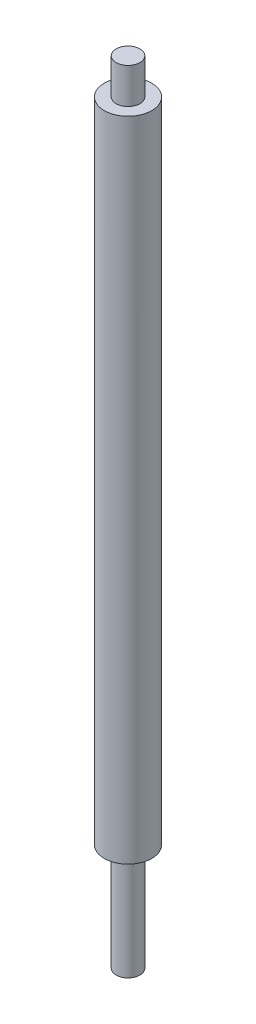
ISO-10303-21;
HEADER;
FILE_DESCRIPTION(('STEP AP214'),'2;1');
FILE_NAME('part.step','',(''),(''),'','','');
FILE_SCHEMA(('AUTOMOTIVE_DESIGN { 1 0 10303 214 1 1 1 1 }'));
ENDSEC;
DATA;
#1=APPLICATION_CONTEXT('core data for automotive mechanical design processes');
#2=APPLICATION_PROTOCOL_DEFINITION('international standard','automotive_design',2000,#1);
#3=PRODUCT_CONTEXT('',#1,'mechanical');
#4=PRODUCT('Part','Part','',(#3));
#5=PRODUCT_RELATED_PRODUCT_CATEGORY('part','',(#4));
#6=PRODUCT_DEFINITION_FORMATION('','',#4);
#7=PRODUCT_DEFINITION_CONTEXT('part definition',#1,'design');
#8=PRODUCT_DEFINITION('design','',#6,#7);
#9=PRODUCT_DEFINITION_SHAPE('','',#8);
#10=(LENGTH_UNIT() NAMED_UNIT(*) SI_UNIT(.MILLI.,.METRE.));
#11=(NAMED_UNIT(*) PLANE_ANGLE_UNIT() SI_UNIT($,.RADIAN.));
#12=(NAMED_UNIT(*) SI_UNIT($,.STERADIAN.) SOLID_ANGLE_UNIT());
#13=UNCERTAINTY_MEASURE_WITH_UNIT(LENGTH_MEASURE(1.E-05),#10,'distance_accuracy_value','');
#14=(GEOMETRIC_REPRESENTATION_CONTEXT(3) GLOBAL_UNCERTAINTY_ASSIGNED_CONTEXT((#13)) GLOBAL_UNIT_ASSIGNED_CONTEXT((#10,
#11,#12)) REPRESENTATION_CONTEXT('',''));
#15=CARTESIAN_POINT('',(0.,0.,0.));
#16=DIRECTION('',(0.,0.,1.));
#17=DIRECTION('',(1.,0.,0.));
#18=AXIS2_PLACEMENT_3D('',#15,#16,#17);
#19=CARTESIAN_POINT('',(0.,211.1375,0.));
#20=DIRECTION('',(0.,-1.,0.));
#21=DIRECTION('',(0.,0.,-1.));
#22=AXIS2_PLACEMENT_3D('',#19,#20,#21);
#23=CYLINDRICAL_SURFACE('',#22,6.35);
#24=CARTESIAN_POINT('',(0.,201.6125,0.));
#25=DIRECTION('',(0.,1.,0.));
#26=DIRECTION('',(0.,0.,1.));
#27=AXIS2_PLACEMENT_3D('',#24,#25,#26);
#28=CIRCLE('',#27,6.35);
#29=CARTESIAN_POINT('',(0.,201.6125,6.35));
#30=VERTEX_POINT('',#29);
#31=EDGE_CURVE('E10',#30,#30,#28,.T.);
#32=ORIENTED_EDGE('',*,*,#31,.F.);
#33=EDGE_LOOP('',(#32));
#34=FACE_BOUND('',#33,.T.);
#35=CARTESIAN_POINT('',(0.,28.575,0.));
#36=DIRECTION('',(0.,-1.,0.));
#37=DIRECTION('',(0.,0.,-1.));
#38=AXIS2_PLACEMENT_3D('',#35,#36,#37);
#39=CIRCLE('',#38,6.35);
#40=CARTESIAN_POINT('',(0.,28.575,-6.35));
#41=VERTEX_POINT('',#40);
#42=EDGE_CURVE('E46',#41,#41,#39,.T.);
#43=ORIENTED_EDGE('',*,*,#42,.F.);
#44=EDGE_LOOP('',(#43));
#45=FACE_BOUND('',#44,.T.);
#46=ADVANCED_FACE('F31',(#34,#45),#23,.T.);
#47=CARTESIAN_POINT('',(0.,201.6125,0.));
#48=DIRECTION('',(0.,1.,0.));
#49=DIRECTION('',(0.,0.,1.));
#50=AXIS2_PLACEMENT_3D('',#47,#48,#49);
#51=PLANE('',#50);
#52=CARTESIAN_POINT('',(0.,201.6125,0.));
#53=DIRECTION('',(0.,1.,0.));
#54=DIRECTION('',(0.,0.,1.));
#55=AXIS2_PLACEMENT_3D('',#52,#53,#54);
#56=CIRCLE('',#55,3.175);
#57=CARTESIAN_POINT('',(0.,201.6125,3.175));
#58=VERTEX_POINT('',#57);
#59=EDGE_CURVE('E37',#58,#58,#56,.T.);
#60=ORIENTED_EDGE('',*,*,#59,.F.);
#61=EDGE_LOOP('',(#60));
#62=FACE_BOUND('',#61,.T.);
#63=ORIENTED_EDGE('',*,*,#31,.T.);
#64=EDGE_LOOP('',(#63));
#65=FACE_BOUND('',#64,.T.);
#66=ADVANCED_FACE('F68',(#62,#65),#51,.T.);
#67=CARTESIAN_POINT('',(0.,201.6125,0.));
#68=DIRECTION('',(0.,1.,0.));
#69=DIRECTION('',(0.,0.,1.));
#70=AXIS2_PLACEMENT_3D('',#67,#68,#69);
#71=CYLINDRICAL_SURFACE('',#70,3.175);
#72=CARTESIAN_POINT('',(0.,211.1375,0.));
#73=DIRECTION('',(0.,1.,0.));
#74=DIRECTION('',(0.,0.,1.));
#75=AXIS2_PLACEMENT_3D('',#72,#73,#74);
#76=CIRCLE('',#75,3.175);
#77=CARTESIAN_POINT('',(0.,211.1375,3.175));
#78=VERTEX_POINT('',#77);
#79=EDGE_CURVE('E41',#78,#78,#76,.T.);
#80=CARTESIAN_POINT('',(0.,201.6125,3.175));
#81=CARTESIAN_POINT('',(0.,201.71171875,3.175));
#82=CARTESIAN_POINT('',(0.,201.8109375,3.175));
#83=CARTESIAN_POINT('',(0.,202.009375,3.175));
#84=CARTESIAN_POINT('',(0.,202.10859375,3.175));
#85=CARTESIAN_POINT('',(0.,202.30703125,3.175));
#86=CARTESIAN_POINT('',(0.,202.40625,3.175));
#87=CARTESIAN_POINT('',(0.,202.6046875,3.175));
#88=CARTESIAN_POINT('',(0.,202.70390625,3.175));
#89=CARTESIAN_POINT('',(0.,202.90234375,3.175));
#90=CARTESIAN_POINT('',(0.,203.0015625,3.175));
#91=CARTESIAN_POINT('',(0.,203.2,3.175));
#92=CARTESIAN_POINT('',(0.,203.29921875,3.175));
#93=CARTESIAN_POINT('',(0.,203.49765625,3.175));
#94=CARTESIAN_POINT('',(0.,203.596875,3.175));
#95=CARTESIAN_POINT('',(0.,203.7953125,3.175));
#96=CARTESIAN_POINT('',(0.,203.89453125,3.175));
#97=CARTESIAN_POINT('',(0.,204.09296875,3.175));
#98=CARTESIAN_POINT('',(0.,204.1921875,3.175));
#99=CARTESIAN_POINT('',(0.,204.390625,3.175));
#100=CARTESIAN_POINT('',(0.,204.48984375,3.175));
#101=CARTESIAN_POINT('',(0.,204.68828125,3.175));
#102=CARTESIAN_POINT('',(0.,204.7875,3.175));
#103=CARTESIAN_POINT('',(0.,204.9859375,3.175));
#104=CARTESIAN_POINT('',(0.,205.08515625,3.175));
#105=CARTESIAN_POINT('',(0.,205.28359375,3.175));
#106=CARTESIAN_POINT('',(0.,205.3828125,3.175));
#107=CARTESIAN_POINT('',(0.,205.58125,3.175));
#108=CARTESIAN_POINT('',(0.,205.68046875,3.175));
#109=CARTESIAN_POINT('',(0.,205.87890625,3.175));
#110=CARTESIAN_POINT('',(0.,205.978125,3.175));
#111=CARTESIAN_POINT('',(0.,206.1765625,3.175));
#112=CARTESIAN_POINT('',(0.,206.27578125,3.175));
#113=CARTESIAN_POINT('',(0.,206.47421875,3.175));
#114=CARTESIAN_POINT('',(0.,206.5734375,3.175));
#115=CARTESIAN_POINT('',(0.,206.771875,3.175));
#116=CARTESIAN_POINT('',(0.,206.87109375,3.175));
#117=CARTESIAN_POINT('',(0.,207.06953125,3.175));
#118=CARTESIAN_POINT('',(0.,207.16875,3.175));
#119=CARTESIAN_POINT('',(0.,207.3671875,3.175));
#120=CARTESIAN_POINT('',(0.,207.46640625,3.175));
#121=CARTESIAN_POINT('',(0.,207.66484375,3.175));
#122=CARTESIAN_POINT('',(0.,207.7640625,3.175));
#123=CARTESIAN_POINT('',(0.,207.9625,3.175));
#124=CARTESIAN_POINT('',(0.,208.06171875,3.175));
#125=CARTESIAN_POINT('',(0.,208.26015625,3.175));
#126=CARTESIAN_POINT('',(0.,208.359375,3.175));
#127=CARTESIAN_POINT('',(0.,208.5578125,3.175));
#128=CARTESIAN_POINT('',(0.,208.65703125,3.175));
#129=CARTESIAN_POINT('',(0.,208.85546875,3.175));
#130=CARTESIAN_POINT('',(0.,208.9546875,3.175));
#131=CARTESIAN_POINT('',(0.,209.153125,3.175));
#132=CARTESIAN_POINT('',(0.,209.25234375,3.175));
#133=CARTESIAN_POINT('',(0.,209.45078125,3.175));
#134=CARTESIAN_POINT('',(0.,209.55,3.175));
#135=CARTESIAN_POINT('',(0.,209.7484375,3.175));
#136=CARTESIAN_POINT('',(0.,209.84765625,3.175));
#137=CARTESIAN_POINT('',(0.,210.04609375,3.175));
#138=CARTESIAN_POINT('',(0.,210.1453125,3.175));
#139=CARTESIAN_POINT('',(0.,210.34375,3.175));
#140=CARTESIAN_POINT('',(0.,210.44296875,3.175));
#141=CARTESIAN_POINT('',(0.,210.64140625,3.175));
#142=CARTESIAN_POINT('',(0.,210.740625,3.175));
#143=CARTESIAN_POINT('',(0.,210.9390625,3.175));
#144=CARTESIAN_POINT('',(0.,211.03828125,3.175));
#145=CARTESIAN_POINT('',(0.,211.1375,3.175));
#146=B_SPLINE_CURVE_WITH_KNOTS('',3,(#80,#81,#82,#83,#84,#85,#86,#87,#88,#89,#90,#91,#92,#93,
#94,#95,#96,#97,#98,#99,#100,#101,#102,#103,#104,#105,#106,#107,#108,#109,#110,#111,#112,#113,
#114,#115,#116,#117,#118,#119,#120,#121,#122,#123,#124,#125,#126,#127,#128,#129,#130,#131,#132,
#133,#134,#135,#136,#137,#138,#139,#140,#141,#142,#143,#144,#145),.UNSPECIFIED.,.F.,.F.,(4,2,2,
2,2,2,2,2,2,2,2,2,2,2,2,2,2,2,2,2,2,2,2,2,2,2,2,2,2,2,2,2,4),(0.,0.29765625,0.5953125,
0.892968750000001,1.190625,1.48828125,1.7859375,2.08359375,2.38125,2.67890625,2.9765625,
3.27421875,3.571875,3.86953125,4.1671875,4.46484375,4.7625,5.06015625,5.3578125,5.65546875,
5.953125,6.25078125,6.5484375,6.84609375,7.14375,7.44140625,7.7390625,8.03671875000001,8.334375,
8.63203125,8.92968750000001,9.22734375000001,9.52500000000001),.UNSPECIFIED.);
#147=EDGE_CURVE('BSEAM73',#58,#78,#146,.T.);
#148=ORIENTED_EDGE('',*,*,#59,.T.);
#149=ORIENTED_EDGE('',*,*,#79,.F.);
#150=ORIENTED_EDGE('',*,*,#147,.T.);
#151=ORIENTED_EDGE('',*,*,#147,.F.);
#152=EDGE_LOOP('',(#148,#150,#149,#151));
#153=FACE_BOUND('',#152,.T.);
#154=ADVANCED_FACE('F73',(#153),#71,.T.);
#155=CARTESIAN_POINT('',(0.,211.1375,0.));
#156=DIRECTION('',(0.,1.,0.));
#157=DIRECTION('',(0.,0.,1.));
#158=AXIS2_PLACEMENT_3D('',#155,#156,#157);
#159=PLANE('',#158);
#160=ORIENTED_EDGE('',*,*,#79,.T.);
#161=EDGE_LOOP('',(#160));
#162=FACE_BOUND('',#161,.T.);
#163=ADVANCED_FACE('F63',(#162),#159,.T.);
#164=CARTESIAN_POINT('',(0.,28.575,0.));
#165=DIRECTION('',(0.,-1.,0.));
#166=DIRECTION('',(0.,0.,-1.));
#167=AXIS2_PLACEMENT_3D('',#164,#165,#166);
#168=PLANE('',#167);
#169=CARTESIAN_POINT('',(0.,28.575,0.));
#170=DIRECTION('',(0.,-1.,0.));
#171=DIRECTION('',(0.,0.,-1.));
#172=AXIS2_PLACEMENT_3D('',#169,#170,#171);
#173=CIRCLE('',#172,3.175);
#174=CARTESIAN_POINT('',(0.,28.575,-3.175));
#175=VERTEX_POINT('',#174);
#176=EDGE_CURVE('E50',#175,#175,#173,.T.);
#177=ORIENTED_EDGE('',*,*,#176,.F.);
#178=EDGE_LOOP('',(#177));
#179=FACE_BOUND('',#178,.T.);
#180=ORIENTED_EDGE('',*,*,#42,.T.);
#181=EDGE_LOOP('',(#180));
#182=FACE_BOUND('',#181,.T.);
#183=ADVANCED_FACE('F60',(#179,#182),#168,.T.);
#184=CARTESIAN_POINT('',(0.,28.575,0.));
#185=DIRECTION('',(0.,-1.,0.));
#186=DIRECTION('',(0.,0.,-1.));
#187=AXIS2_PLACEMENT_3D('',#184,#185,#186);
#188=CYLINDRICAL_SURFACE('',#187,3.175);
#189=ORIENTED_EDGE('',*,*,#176,.T.);
#190=EDGE_LOOP('',(#189));
#191=FACE_BOUND('',#190,.T.);
#192=CARTESIAN_POINT('',(0.,0.,0.));
#193=DIRECTION('',(0.,-1.,0.));
#194=DIRECTION('',(0.,0.,-1.));
#195=AXIS2_PLACEMENT_3D('',#192,#193,#194);
#196=CIRCLE('',#195,3.175);
#197=CARTESIAN_POINT('',(0.,0.,-3.175));
#198=VERTEX_POINT('',#197);
#199=EDGE_CURVE('E51',#198,#198,#196,.T.);
#200=ORIENTED_EDGE('',*,*,#199,.F.);
#201=EDGE_LOOP('',(#200));
#202=FACE_BOUND('',#201,.T.);
#203=ADVANCED_FACE('F57',(#191,#202),#188,.T.);
#204=CARTESIAN_POINT('',(0.,0.,0.));
#205=DIRECTION('',(0.,1.,0.));
#206=DIRECTION('',(0.,0.,1.));
#207=AXIS2_PLACEMENT_3D('',#204,#205,#206);
#208=PLANE('',#207);
#209=ORIENTED_EDGE('',*,*,#199,.T.);
#210=EDGE_LOOP('',(#209));
#211=FACE_BOUND('',#210,.T.);
#212=ADVANCED_FACE('F83',(#211),#208,.F.);
#213=CLOSED_SHELL('',(#46,#66,#154,#163,#183,#203,#212));
#214=MANIFOLD_SOLID_BREP('B2',#213);
#215=ADVANCED_BREP_SHAPE_REPRESENTATION('',(#18,#214),#14);
#216=SHAPE_DEFINITION_REPRESENTATION(#9,#215);
ENDSEC;
END-ISO-10303-21;
